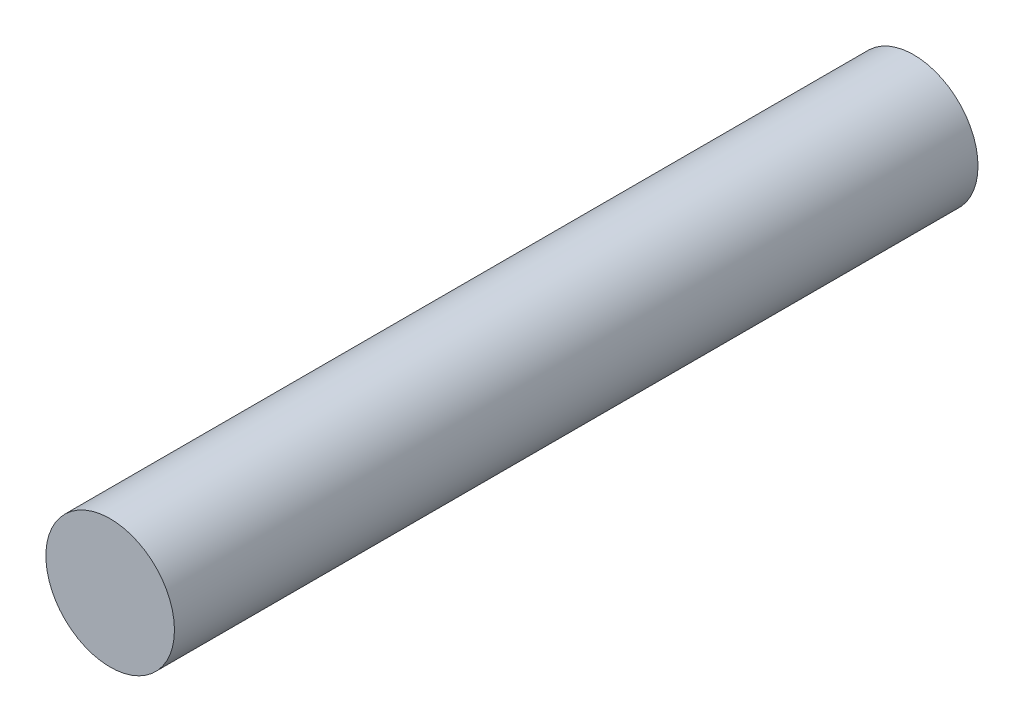
ISO-10303-21;
HEADER;
FILE_DESCRIPTION(('STEP AP214'),'2;1');
FILE_NAME('part.step','',(''),(''),'','','');
FILE_SCHEMA(('AUTOMOTIVE_DESIGN { 1 0 10303 214 1 1 1 1 }'));
ENDSEC;
DATA;
#1=APPLICATION_CONTEXT('core data for automotive mechanical design processes');
#2=APPLICATION_PROTOCOL_DEFINITION('international standard','automotive_design',2000,#1);
#3=PRODUCT_CONTEXT('',#1,'mechanical');
#4=PRODUCT('Part','Part','',(#3));
#5=PRODUCT_RELATED_PRODUCT_CATEGORY('part','',(#4));
#6=PRODUCT_DEFINITION_FORMATION('','',#4);
#7=PRODUCT_DEFINITION_CONTEXT('part definition',#1,'design');
#8=PRODUCT_DEFINITION('design','',#6,#7);
#9=PRODUCT_DEFINITION_SHAPE('','',#8);
#10=(LENGTH_UNIT() NAMED_UNIT(*) SI_UNIT(.MILLI.,.METRE.));
#11=(NAMED_UNIT(*) PLANE_ANGLE_UNIT() SI_UNIT($,.RADIAN.));
#12=(NAMED_UNIT(*) SI_UNIT($,.STERADIAN.) SOLID_ANGLE_UNIT());
#13=UNCERTAINTY_MEASURE_WITH_UNIT(LENGTH_MEASURE(1.E-05),#10,'distance_accuracy_value','');
#14=(GEOMETRIC_REPRESENTATION_CONTEXT(3) GLOBAL_UNCERTAINTY_ASSIGNED_CONTEXT((#13)) GLOBAL_UNIT_ASSIGNED_CONTEXT((#10,
#11,#12)) REPRESENTATION_CONTEXT('',''));
#15=CARTESIAN_POINT('',(0.,0.,0.));
#16=DIRECTION('',(0.,0.,1.));
#17=DIRECTION('',(1.,0.,0.));
#18=AXIS2_PLACEMENT_3D('',#15,#16,#17);
#19=CARTESIAN_POINT('',(0.,0.,30.));
#20=DIRECTION('',(0.,0.,-1.));
#21=DIRECTION('',(-1.,0.,0.));
#22=AXIS2_PLACEMENT_3D('',#19,#20,#21);
#23=CYLINDRICAL_SURFACE('',#22,2.4);
#24=CARTESIAN_POINT('',(0.,0.,30.));
#25=DIRECTION('',(0.,0.,1.));
#26=DIRECTION('',(1.,0.,0.));
#27=AXIS2_PLACEMENT_3D('',#24,#25,#26);
#28=CIRCLE('',#27,2.4);
#29=CARTESIAN_POINT('',(2.4,0.,30.));
#30=VERTEX_POINT('',#29);
#31=EDGE_CURVE('E10',#30,#30,#28,.T.);
#32=ORIENTED_EDGE('',*,*,#31,.F.);
#33=EDGE_LOOP('',(#32));
#34=FACE_BOUND('',#33,.T.);
#35=CARTESIAN_POINT('',(0.,0.,0.));
#36=DIRECTION('',(0.,0.,1.));
#37=DIRECTION('',(1.,0.,0.));
#38=AXIS2_PLACEMENT_3D('',#35,#36,#37);
#39=CIRCLE('',#38,2.4);
#40=CARTESIAN_POINT('',(2.4,0.,0.));
#41=VERTEX_POINT('',#40);
#42=EDGE_CURVE('E34',#41,#41,#39,.T.);
#43=ORIENTED_EDGE('',*,*,#42,.T.);
#44=EDGE_LOOP('',(#43));
#45=FACE_BOUND('',#44,.T.);
#46=ADVANCED_FACE('F31',(#34,#45),#23,.T.);
#47=CARTESIAN_POINT('',(0.,0.,30.));
#48=DIRECTION('',(0.,0.,1.));
#49=DIRECTION('',(1.,0.,0.));
#50=AXIS2_PLACEMENT_3D('',#47,#48,#49);
#51=PLANE('',#50);
#52=ORIENTED_EDGE('',*,*,#31,.T.);
#53=EDGE_LOOP('',(#52));
#54=FACE_BOUND('',#53,.T.);
#55=ADVANCED_FACE('F46',(#54),#51,.T.);
#56=CARTESIAN_POINT('',(0.,0.,0.));
#57=DIRECTION('',(0.,0.,1.));
#58=DIRECTION('',(1.,0.,0.));
#59=AXIS2_PLACEMENT_3D('',#56,#57,#58);
#60=PLANE('',#59);
#61=ORIENTED_EDGE('',*,*,#42,.F.);
#62=EDGE_LOOP('',(#61));
#63=FACE_BOUND('',#62,.T.);
#64=ADVANCED_FACE('F44',(#63),#60,.F.);
#65=CLOSED_SHELL('',(#46,#55,#64));
#66=MANIFOLD_SOLID_BREP('B2',#65);
#67=ADVANCED_BREP_SHAPE_REPRESENTATION('',(#18,#66),#14);
#68=SHAPE_DEFINITION_REPRESENTATION(#9,#67);
ENDSEC;
END-ISO-10303-21;
